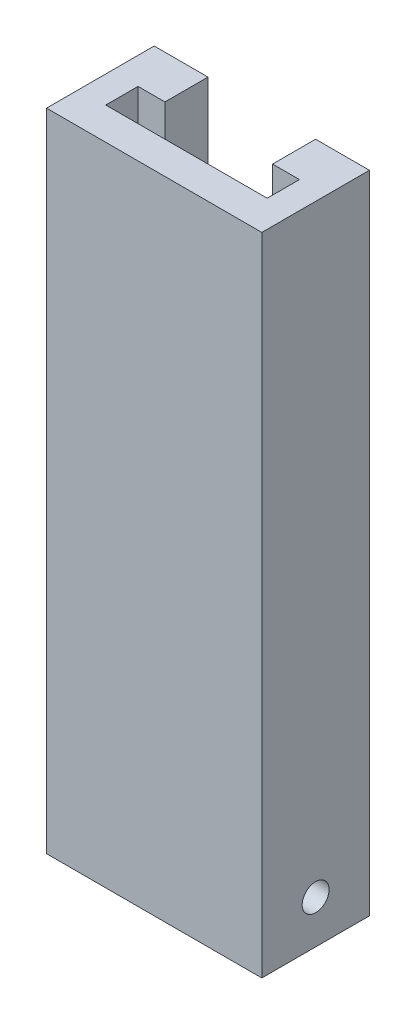
ISO-10303-21;
HEADER;
FILE_DESCRIPTION(('STEP AP214'),'2;1');
FILE_NAME('part.step','',(''),(''),'','','');
FILE_SCHEMA(('AUTOMOTIVE_DESIGN { 1 0 10303 214 1 1 1 1 }'));
ENDSEC;
DATA;
#1=APPLICATION_CONTEXT('core data for automotive mechanical design processes');
#2=APPLICATION_PROTOCOL_DEFINITION('international standard','automotive_design',2000,#1);
#3=PRODUCT_CONTEXT('',#1,'mechanical');
#4=PRODUCT('Part','Part','',(#3));
#5=PRODUCT_RELATED_PRODUCT_CATEGORY('part','',(#4));
#6=PRODUCT_DEFINITION_FORMATION('','',#4);
#7=PRODUCT_DEFINITION_CONTEXT('part definition',#1,'design');
#8=PRODUCT_DEFINITION('design','',#6,#7);
#9=PRODUCT_DEFINITION_SHAPE('','',#8);
#10=(LENGTH_UNIT() NAMED_UNIT(*) SI_UNIT(.MILLI.,.METRE.));
#11=(NAMED_UNIT(*) PLANE_ANGLE_UNIT() SI_UNIT($,.RADIAN.));
#12=(NAMED_UNIT(*) SI_UNIT($,.STERADIAN.) SOLID_ANGLE_UNIT());
#13=UNCERTAINTY_MEASURE_WITH_UNIT(LENGTH_MEASURE(1.E-05),#10,'distance_accuracy_value','');
#14=(GEOMETRIC_REPRESENTATION_CONTEXT(3) GLOBAL_UNCERTAINTY_ASSIGNED_CONTEXT((#13)) GLOBAL_UNIT_ASSIGNED_CONTEXT((#10,
#11,#12)) REPRESENTATION_CONTEXT('',''));
#15=CARTESIAN_POINT('',(0.,0.,0.));
#16=DIRECTION('',(0.,0.,1.));
#17=DIRECTION('',(1.,0.,0.));
#18=AXIS2_PLACEMENT_3D('',#15,#16,#17);
#19=CARTESIAN_POINT('',(20.,120.,-10.));
#20=DIRECTION('',(-1.,0.,0.));
#21=DIRECTION('',(0.,0.,1.));
#22=AXIS2_PLACEMENT_3D('',#19,#20,#21);
#23=PLANE('',#22);
#24=CARTESIAN_POINT('',(20.,8.,0.));
#25=DIRECTION('',(-1.,0.,0.));
#26=DIRECTION('',(0.,0.,1.));
#27=AXIS2_PLACEMENT_3D('',#24,#25,#26);
#28=CIRCLE('',#27,2.5);
#29=CARTESIAN_POINT('',(20.,8.,2.49999999999999));
#30=VERTEX_POINT('',#29);
#31=EDGE_CURVE('E234',#30,#30,#28,.T.);
#32=ORIENTED_EDGE('',*,*,#31,.T.);
#33=EDGE_LOOP('',(#32));
#34=FACE_BOUND('',#33,.T.);
#35=DIRECTION('',(0.,0.,-1.));
#36=VECTOR('',#35,1.);
#37=CARTESIAN_POINT('',(20.,0.,-10.));
#38=LINE('',#37,#36);
#39=CARTESIAN_POINT('',(20.,0.,10.));
#40=VERTEX_POINT('',#39);
#41=CARTESIAN_POINT('',(20.,0.,-10.));
#42=VERTEX_POINT('',#41);
#43=EDGE_CURVE('E238',#40,#42,#38,.T.);
#44=ORIENTED_EDGE('',*,*,#43,.T.);
#45=DIRECTION('',(0.,-1.,0.));
#46=VECTOR('',#45,1.);
#47=CARTESIAN_POINT('',(20.,120.,-10.));
#48=LINE('',#47,#46);
#49=CARTESIAN_POINT('',(20.,120.,-10.));
#50=VERTEX_POINT('',#49);
#51=EDGE_CURVE('E11',#50,#42,#48,.T.);
#52=ORIENTED_EDGE('',*,*,#51,.F.);
#53=DIRECTION('',(0.,0.,-1.));
#54=VECTOR('',#53,1.);
#55=CARTESIAN_POINT('',(20.,120.,-10.));
#56=LINE('',#55,#54);
#57=CARTESIAN_POINT('',(20.,120.,10.));
#58=VERTEX_POINT('',#57);
#59=EDGE_CURVE('E242',#58,#50,#56,.T.);
#60=ORIENTED_EDGE('',*,*,#59,.F.);
#61=DIRECTION('',(0.,-1.,0.));
#62=VECTOR('',#61,1.);
#63=CARTESIAN_POINT('',(20.,120.,10.));
#64=LINE('',#63,#62);
#65=EDGE_CURVE('E253',#58,#40,#64,.T.);
#66=ORIENTED_EDGE('',*,*,#65,.T.);
#67=EDGE_LOOP('',(#44,#52,#60,#66));
#68=FACE_BOUND('',#67,.T.);
#69=ADVANCED_FACE('F45',(#34,#68),#23,.F.);
#70=CARTESIAN_POINT('',(-20.,120.,-10.));
#71=DIRECTION('',(0.,0.,1.));
#72=DIRECTION('',(1.,0.,0.));
#73=AXIS2_PLACEMENT_3D('',#70,#71,#72);
#74=PLANE('',#73);
#75=DIRECTION('',(-1.,0.,0.));
#76=VECTOR('',#75,1.);
#77=CARTESIAN_POINT('',(-20.,120.,-10.));
#78=LINE('',#77,#76);
#79=CARTESIAN_POINT('',(-10.,120.,-10.));
#80=VERTEX_POINT('',#79);
#81=CARTESIAN_POINT('',(-20.,120.,-10.));
#82=VERTEX_POINT('',#81);
#83=EDGE_CURVE('E245',#80,#82,#78,.T.);
#84=ORIENTED_EDGE('',*,*,#83,.F.);
#85=DIRECTION('',(0.,1.,0.));
#86=VECTOR('',#85,1.);
#87=CARTESIAN_POINT('',(-10.,16.,-10.));
#88=LINE('',#87,#86);
#89=CARTESIAN_POINT('',(-10.,16.,-10.));
#90=VERTEX_POINT('',#89);
#91=EDGE_CURVE('E220',#90,#80,#88,.T.);
#92=ORIENTED_EDGE('',*,*,#91,.F.);
#93=DIRECTION('',(-1.,0.,0.));
#94=VECTOR('',#93,1.);
#95=CARTESIAN_POINT('',(10.,16.,-10.));
#96=LINE('',#95,#94);
#97=CARTESIAN_POINT('',(10.,16.,-10.));
#98=VERTEX_POINT('',#97);
#99=EDGE_CURVE('E185',#98,#90,#96,.T.);
#100=ORIENTED_EDGE('',*,*,#99,.F.);
#101=DIRECTION('',(0.,1.,0.));
#102=VECTOR('',#101,1.);
#103=CARTESIAN_POINT('',(10.,16.,-10.));
#104=LINE('',#103,#102);
#105=CARTESIAN_POINT('',(10.,120.,-10.));
#106=VERTEX_POINT('',#105);
#107=EDGE_CURVE('E223',#98,#106,#104,.T.);
#108=ORIENTED_EDGE('',*,*,#107,.T.);
#109=EDGE_CURVE('E97',#50,#106,#78,.T.);
#110=ORIENTED_EDGE('',*,*,#109,.F.);
#111=ORIENTED_EDGE('',*,*,#51,.T.);
#112=DIRECTION('',(-1.,0.,0.));
#113=VECTOR('',#112,1.);
#114=CARTESIAN_POINT('',(-20.,0.,-10.));
#115=LINE('',#114,#113);
#116=CARTESIAN_POINT('',(-20.,0.,-10.));
#117=VERTEX_POINT('',#116);
#118=EDGE_CURVE('E257',#42,#117,#115,.T.);
#119=ORIENTED_EDGE('',*,*,#118,.T.);
#120=DIRECTION('',(0.,-1.,0.));
#121=VECTOR('',#120,1.);
#122=CARTESIAN_POINT('',(-20.,120.,-10.));
#123=LINE('',#122,#121);
#124=EDGE_CURVE('E53',#82,#117,#123,.T.);
#125=ORIENTED_EDGE('',*,*,#124,.F.);
#126=EDGE_LOOP('',(#84,#92,#100,#108,#110,#111,#119,#125));
#127=FACE_BOUND('',#126,.T.);
#128=ADVANCED_FACE('F294',(#127),#74,.F.);
#129=CARTESIAN_POINT('',(-20.,120.,-10.));
#130=DIRECTION('',(1.,0.,0.));
#131=DIRECTION('',(0.,0.,-1.));
#132=AXIS2_PLACEMENT_3D('',#129,#130,#131);
#133=PLANE('',#132);
#134=CARTESIAN_POINT('',(-20.,8.,0.));
#135=DIRECTION('',(-1.,0.,0.));
#136=DIRECTION('',(0.,0.,1.));
#137=AXIS2_PLACEMENT_3D('',#134,#135,#136);
#138=CIRCLE('',#137,2.5);
#139=CARTESIAN_POINT('',(-20.,8.,2.50000000000001));
#140=VERTEX_POINT('',#139);
#141=EDGE_CURVE('E216',#140,#140,#138,.T.);
#142=ORIENTED_EDGE('',*,*,#141,.F.);
#143=EDGE_LOOP('',(#142));
#144=FACE_BOUND('',#143,.T.);
#145=DIRECTION('',(0.,0.,1.));
#146=VECTOR('',#145,1.);
#147=CARTESIAN_POINT('',(-20.,0.,-10.));
#148=LINE('',#147,#146);
#149=CARTESIAN_POINT('',(-20.,0.,10.));
#150=VERTEX_POINT('',#149);
#151=EDGE_CURVE('E260',#117,#150,#148,.T.);
#152=ORIENTED_EDGE('',*,*,#151,.T.);
#153=DIRECTION('',(0.,-1.,0.));
#154=VECTOR('',#153,1.);
#155=CARTESIAN_POINT('',(-20.,120.,10.));
#156=LINE('',#155,#154);
#157=CARTESIAN_POINT('',(-20.,120.,10.));
#158=VERTEX_POINT('',#157);
#159=EDGE_CURVE('E267',#158,#150,#156,.T.);
#160=ORIENTED_EDGE('',*,*,#159,.F.);
#161=DIRECTION('',(0.,0.,1.));
#162=VECTOR('',#161,1.);
#163=CARTESIAN_POINT('',(-20.,120.,-10.));
#164=LINE('',#163,#162);
#165=EDGE_CURVE('E248',#82,#158,#164,.T.);
#166=ORIENTED_EDGE('',*,*,#165,.F.);
#167=ORIENTED_EDGE('',*,*,#124,.T.);
#168=EDGE_LOOP('',(#152,#160,#166,#167));
#169=FACE_BOUND('',#168,.T.);
#170=ADVANCED_FACE('F275',(#144,#169),#133,.F.);
#171=CARTESIAN_POINT('',(-20.,120.,10.));
#172=DIRECTION('',(0.,0.,-1.));
#173=DIRECTION('',(-1.,0.,0.));
#174=AXIS2_PLACEMENT_3D('',#171,#172,#173);
#175=PLANE('',#174);
#176=DIRECTION('',(1.,0.,0.));
#177=VECTOR('',#176,1.);
#178=CARTESIAN_POINT('',(-20.,0.,10.));
#179=LINE('',#178,#177);
#180=EDGE_CURVE('E90',#150,#40,#179,.T.);
#181=ORIENTED_EDGE('',*,*,#180,.T.);
#182=ORIENTED_EDGE('',*,*,#65,.F.);
#183=DIRECTION('',(1.,0.,0.));
#184=VECTOR('',#183,1.);
#185=CARTESIAN_POINT('',(-20.,120.,10.));
#186=LINE('',#185,#184);
#187=EDGE_CURVE('E69',#158,#58,#186,.T.);
#188=ORIENTED_EDGE('',*,*,#187,.F.);
#189=ORIENTED_EDGE('',*,*,#159,.T.);
#190=EDGE_LOOP('',(#181,#182,#188,#189));
#191=FACE_BOUND('',#190,.T.);
#192=ADVANCED_FACE('F284',(#191),#175,.F.);
#193=CARTESIAN_POINT('',(0.,120.,0.));
#194=DIRECTION('',(0.,1.,0.));
#195=DIRECTION('',(0.,0.,1.));
#196=AXIS2_PLACEMENT_3D('',#193,#194,#195);
#197=PLANE('',#196);
#198=DIRECTION('',(0.,0.,1.));
#199=VECTOR('',#198,1.);
#200=CARTESIAN_POINT('',(-10.,120.,-10.));
#201=LINE('',#200,#199);
#202=CARTESIAN_POINT('',(-10.,120.,-2.));
#203=VERTEX_POINT('',#202);
#204=EDGE_CURVE('E172',#80,#203,#201,.T.);
#205=ORIENTED_EDGE('',*,*,#204,.F.);
#206=ORIENTED_EDGE('',*,*,#83,.T.);
#207=ORIENTED_EDGE('',*,*,#165,.T.);
#208=ORIENTED_EDGE('',*,*,#187,.T.);
#209=ORIENTED_EDGE('',*,*,#59,.T.);
#210=ORIENTED_EDGE('',*,*,#109,.T.);
#211=DIRECTION('',(0.,0.,-1.));
#212=VECTOR('',#211,1.);
#213=CARTESIAN_POINT('',(10.,120.,-2.));
#214=LINE('',#213,#212);
#215=CARTESIAN_POINT('',(10.,120.,-2.));
#216=VERTEX_POINT('',#215);
#217=EDGE_CURVE('E207',#216,#106,#214,.T.);
#218=ORIENTED_EDGE('',*,*,#217,.F.);
#219=DIRECTION('',(-1.,0.,0.));
#220=VECTOR('',#219,1.);
#221=CARTESIAN_POINT('',(15.,120.,-2.));
#222=LINE('',#221,#220);
#223=CARTESIAN_POINT('',(15.,120.,-2.));
#224=VERTEX_POINT('',#223);
#225=EDGE_CURVE('E203',#224,#216,#222,.T.);
#226=ORIENTED_EDGE('',*,*,#225,.F.);
#227=DIRECTION('',(0.,0.,-1.));
#228=VECTOR('',#227,1.);
#229=CARTESIAN_POINT('',(15.,120.,4.));
#230=LINE('',#229,#228);
#231=CARTESIAN_POINT('',(15.,120.,4.));
#232=VERTEX_POINT('',#231);
#233=EDGE_CURVE('E199',#232,#224,#230,.T.);
#234=ORIENTED_EDGE('',*,*,#233,.F.);
#235=DIRECTION('',(1.,0.,0.));
#236=VECTOR('',#235,1.);
#237=CARTESIAN_POINT('',(-15.,120.,4.));
#238=LINE('',#237,#236);
#239=CARTESIAN_POINT('',(-15.,120.,4.));
#240=VERTEX_POINT('',#239);
#241=EDGE_CURVE('E196',#240,#232,#238,.T.);
#242=ORIENTED_EDGE('',*,*,#241,.F.);
#243=DIRECTION('',(0.,0.,1.));
#244=VECTOR('',#243,1.);
#245=CARTESIAN_POINT('',(-15.,120.,-2.));
#246=LINE('',#245,#244);
#247=CARTESIAN_POINT('',(-15.,120.,-2.));
#248=VERTEX_POINT('',#247);
#249=EDGE_CURVE('E60',#248,#240,#246,.T.);
#250=ORIENTED_EDGE('',*,*,#249,.F.);
#251=DIRECTION('',(-1.,0.,0.));
#252=VECTOR('',#251,1.);
#253=CARTESIAN_POINT('',(-10.,120.,-2.));
#254=LINE('',#253,#252);
#255=EDGE_CURVE('E168',#203,#248,#254,.T.);
#256=ORIENTED_EDGE('',*,*,#255,.F.);
#257=EDGE_LOOP('',(#205,#206,#207,#208,#209,#210,#218,#226,#234,#242,#250,#256));
#258=FACE_BOUND('',#257,.T.);
#259=ADVANCED_FACE('F286',(#258),#197,.T.);
#260=CARTESIAN_POINT('',(0.,0.,0.));
#261=DIRECTION('',(0.,1.,0.));
#262=DIRECTION('',(0.,0.,1.));
#263=AXIS2_PLACEMENT_3D('',#260,#261,#262);
#264=PLANE('',#263);
#265=ORIENTED_EDGE('',*,*,#43,.F.);
#266=ORIENTED_EDGE('',*,*,#180,.F.);
#267=ORIENTED_EDGE('',*,*,#151,.F.);
#268=ORIENTED_EDGE('',*,*,#118,.F.);
#269=EDGE_LOOP('',(#265,#266,#267,#268));
#270=FACE_BOUND('',#269,.T.);
#271=ADVANCED_FACE('F280',(#270),#264,.F.);
#272=CARTESIAN_POINT('',(20.,8.,0.));
#273=DIRECTION('',(-1.,0.,0.));
#274=DIRECTION('',(0.,0.,1.));
#275=AXIS2_PLACEMENT_3D('',#272,#273,#274);
#276=CYLINDRICAL_SURFACE('',#275,2.5);
#277=ORIENTED_EDGE('',*,*,#31,.F.);
#278=EDGE_LOOP('',(#277));
#279=FACE_BOUND('',#278,.T.);
#280=ORIENTED_EDGE('',*,*,#141,.T.);
#281=EDGE_LOOP('',(#280));
#282=FACE_BOUND('',#281,.T.);
#283=ADVANCED_FACE('F305',(#279,#282),#276,.F.);
#284=CARTESIAN_POINT('',(-15.,16.,-2.));
#285=DIRECTION('',(-1.,0.,0.));
#286=DIRECTION('',(0.,0.,1.));
#287=AXIS2_PLACEMENT_3D('',#284,#285,#286);
#288=PLANE('',#287);
#289=ORIENTED_EDGE('',*,*,#249,.T.);
#290=DIRECTION('',(0.,1.,0.));
#291=VECTOR('',#290,1.);
#292=CARTESIAN_POINT('',(-15.,16.,4.));
#293=LINE('',#292,#291);
#294=CARTESIAN_POINT('',(-15.,16.,4.));
#295=VERTEX_POINT('',#294);
#296=EDGE_CURVE('E142',#295,#240,#293,.T.);
#297=ORIENTED_EDGE('',*,*,#296,.F.);
#298=DIRECTION('',(0.,0.,1.));
#299=VECTOR('',#298,1.);
#300=CARTESIAN_POINT('',(-15.,16.,-2.));
#301=LINE('',#300,#299);
#302=CARTESIAN_POINT('',(-15.,16.,-2.));
#303=VERTEX_POINT('',#302);
#304=EDGE_CURVE('E146',#303,#295,#301,.T.);
#305=ORIENTED_EDGE('',*,*,#304,.F.);
#306=DIRECTION('',(0.,1.,0.));
#307=VECTOR('',#306,1.);
#308=CARTESIAN_POINT('',(-15.,16.,-2.));
#309=LINE('',#308,#307);
#310=EDGE_CURVE('E213',#303,#248,#309,.T.);
#311=ORIENTED_EDGE('',*,*,#310,.T.);
#312=EDGE_LOOP('',(#289,#297,#305,#311));
#313=FACE_BOUND('',#312,.T.);
#314=ADVANCED_FACE('F144',(#313),#288,.F.);
#315=CARTESIAN_POINT('',(-10.,16.,-2.));
#316=DIRECTION('',(0.,0.,-1.));
#317=DIRECTION('',(-1.,0.,0.));
#318=AXIS2_PLACEMENT_3D('',#315,#316,#317);
#319=PLANE('',#318);
#320=ORIENTED_EDGE('',*,*,#255,.T.);
#321=ORIENTED_EDGE('',*,*,#310,.F.);
#322=DIRECTION('',(-1.,0.,0.));
#323=VECTOR('',#322,1.);
#324=CARTESIAN_POINT('',(-10.,16.,-2.));
#325=LINE('',#324,#323);
#326=CARTESIAN_POINT('',(-10.,16.,-2.));
#327=VERTEX_POINT('',#326);
#328=EDGE_CURVE('E153',#327,#303,#325,.T.);
#329=ORIENTED_EDGE('',*,*,#328,.F.);
#330=DIRECTION('',(0.,1.,0.));
#331=VECTOR('',#330,1.);
#332=CARTESIAN_POINT('',(-10.,16.,-2.));
#333=LINE('',#332,#331);
#334=EDGE_CURVE('E217',#327,#203,#333,.T.);
#335=ORIENTED_EDGE('',*,*,#334,.T.);
#336=EDGE_LOOP('',(#320,#321,#329,#335));
#337=FACE_BOUND('',#336,.T.);
#338=ADVANCED_FACE('F313',(#337),#319,.F.);
#339=CARTESIAN_POINT('',(-10.,16.,-10.));
#340=DIRECTION('',(-1.,0.,0.));
#341=DIRECTION('',(0.,0.,1.));
#342=AXIS2_PLACEMENT_3D('',#339,#340,#341);
#343=PLANE('',#342);
#344=ORIENTED_EDGE('',*,*,#204,.T.);
#345=ORIENTED_EDGE('',*,*,#334,.F.);
#346=DIRECTION('',(0.,0.,1.));
#347=VECTOR('',#346,1.);
#348=CARTESIAN_POINT('',(-10.,16.,-10.));
#349=LINE('',#348,#347);
#350=EDGE_CURVE('E189',#90,#327,#349,.T.);
#351=ORIENTED_EDGE('',*,*,#350,.F.);
#352=ORIENTED_EDGE('',*,*,#91,.T.);
#353=EDGE_LOOP('',(#344,#345,#351,#352));
#354=FACE_BOUND('',#353,.T.);
#355=ADVANCED_FACE('F329',(#354),#343,.F.);
#356=CARTESIAN_POINT('',(10.,16.,-2.));
#357=DIRECTION('',(1.,0.,0.));
#358=DIRECTION('',(0.,0.,-1.));
#359=AXIS2_PLACEMENT_3D('',#356,#357,#358);
#360=PLANE('',#359);
#361=ORIENTED_EDGE('',*,*,#217,.T.);
#362=ORIENTED_EDGE('',*,*,#107,.F.);
#363=DIRECTION('',(0.,0.,-1.));
#364=VECTOR('',#363,1.);
#365=CARTESIAN_POINT('',(10.,16.,-2.));
#366=LINE('',#365,#364);
#367=CARTESIAN_POINT('',(10.,16.,-2.));
#368=VERTEX_POINT('',#367);
#369=EDGE_CURVE('E181',#368,#98,#366,.T.);
#370=ORIENTED_EDGE('',*,*,#369,.F.);
#371=DIRECTION('',(0.,1.,0.));
#372=VECTOR('',#371,1.);
#373=CARTESIAN_POINT('',(10.,16.,-2.));
#374=LINE('',#373,#372);
#375=EDGE_CURVE('E226',#368,#216,#374,.T.);
#376=ORIENTED_EDGE('',*,*,#375,.T.);
#377=EDGE_LOOP('',(#361,#362,#370,#376));
#378=FACE_BOUND('',#377,.T.);
#379=ADVANCED_FACE('F325',(#378),#360,.F.);
#380=CARTESIAN_POINT('',(15.,16.,-2.));
#381=DIRECTION('',(0.,0.,-1.));
#382=DIRECTION('',(-1.,0.,0.));
#383=AXIS2_PLACEMENT_3D('',#380,#381,#382);
#384=PLANE('',#383);
#385=ORIENTED_EDGE('',*,*,#225,.T.);
#386=ORIENTED_EDGE('',*,*,#375,.F.);
#387=DIRECTION('',(-1.,0.,0.));
#388=VECTOR('',#387,1.);
#389=CARTESIAN_POINT('',(15.,16.,-2.));
#390=LINE('',#389,#388);
#391=CARTESIAN_POINT('',(15.,16.,-2.));
#392=VERTEX_POINT('',#391);
#393=EDGE_CURVE('E177',#392,#368,#390,.T.);
#394=ORIENTED_EDGE('',*,*,#393,.F.);
#395=DIRECTION('',(0.,1.,0.));
#396=VECTOR('',#395,1.);
#397=CARTESIAN_POINT('',(15.,16.,-2.));
#398=LINE('',#397,#396);
#399=EDGE_CURVE('E229',#392,#224,#398,.T.);
#400=ORIENTED_EDGE('',*,*,#399,.T.);
#401=EDGE_LOOP('',(#385,#386,#394,#400));
#402=FACE_BOUND('',#401,.T.);
#403=ADVANCED_FACE('F321',(#402),#384,.F.);
#404=CARTESIAN_POINT('',(15.,16.,4.));
#405=DIRECTION('',(1.,0.,0.));
#406=DIRECTION('',(0.,0.,-1.));
#407=AXIS2_PLACEMENT_3D('',#404,#405,#406);
#408=PLANE('',#407);
#409=ORIENTED_EDGE('',*,*,#233,.T.);
#410=ORIENTED_EDGE('',*,*,#399,.F.);
#411=DIRECTION('',(0.,0.,-1.));
#412=VECTOR('',#411,1.);
#413=CARTESIAN_POINT('',(15.,16.,4.));
#414=LINE('',#413,#412);
#415=CARTESIAN_POINT('',(15.,16.,4.));
#416=VERTEX_POINT('',#415);
#417=EDGE_CURVE('E162',#416,#392,#414,.T.);
#418=ORIENTED_EDGE('',*,*,#417,.F.);
#419=DIRECTION('',(0.,1.,0.));
#420=VECTOR('',#419,1.);
#421=CARTESIAN_POINT('',(15.,16.,4.));
#422=LINE('',#421,#420);
#423=EDGE_CURVE('E152',#416,#232,#422,.T.);
#424=ORIENTED_EDGE('',*,*,#423,.T.);
#425=EDGE_LOOP('',(#409,#410,#418,#424));
#426=FACE_BOUND('',#425,.T.);
#427=ADVANCED_FACE('F318',(#426),#408,.F.);
#428=CARTESIAN_POINT('',(-15.,16.,4.));
#429=DIRECTION('',(0.,0.,1.));
#430=DIRECTION('',(1.,0.,0.));
#431=AXIS2_PLACEMENT_3D('',#428,#429,#430);
#432=PLANE('',#431);
#433=ORIENTED_EDGE('',*,*,#241,.T.);
#434=ORIENTED_EDGE('',*,*,#423,.F.);
#435=DIRECTION('',(1.,0.,0.));
#436=VECTOR('',#435,1.);
#437=CARTESIAN_POINT('',(-15.,16.,4.));
#438=LINE('',#437,#436);
#439=EDGE_CURVE('E156',#295,#416,#438,.T.);
#440=ORIENTED_EDGE('',*,*,#439,.F.);
#441=ORIENTED_EDGE('',*,*,#296,.T.);
#442=EDGE_LOOP('',(#433,#434,#440,#441));
#443=FACE_BOUND('',#442,.T.);
#444=ADVANCED_FACE('F157',(#443),#432,.F.);
#445=CARTESIAN_POINT('',(0.,16.,0.));
#446=DIRECTION('',(0.,1.,0.));
#447=DIRECTION('',(0.,0.,1.));
#448=AXIS2_PLACEMENT_3D('',#445,#446,#447);
#449=PLANE('',#448);
#450=ORIENTED_EDGE('',*,*,#304,.T.);
#451=ORIENTED_EDGE('',*,*,#439,.T.);
#452=ORIENTED_EDGE('',*,*,#417,.T.);
#453=ORIENTED_EDGE('',*,*,#393,.T.);
#454=ORIENTED_EDGE('',*,*,#369,.T.);
#455=ORIENTED_EDGE('',*,*,#99,.T.);
#456=ORIENTED_EDGE('',*,*,#350,.T.);
#457=ORIENTED_EDGE('',*,*,#328,.T.);
#458=EDGE_LOOP('',(#450,#451,#452,#453,#454,#455,#456,#457));
#459=FACE_BOUND('',#458,.T.);
#460=ADVANCED_FACE('F164',(#459),#449,.T.);
#461=CLOSED_SHELL('',(#69,#128,#170,#192,#259,#271,#283,#314,#338,#355,#379,#403,#427,#444,#460));
#462=MANIFOLD_SOLID_BREP('B2',#461);
#463=ADVANCED_BREP_SHAPE_REPRESENTATION('',(#18,#462),#14);
#464=SHAPE_DEFINITION_REPRESENTATION(#9,#463);
ENDSEC;
END-ISO-10303-21;
